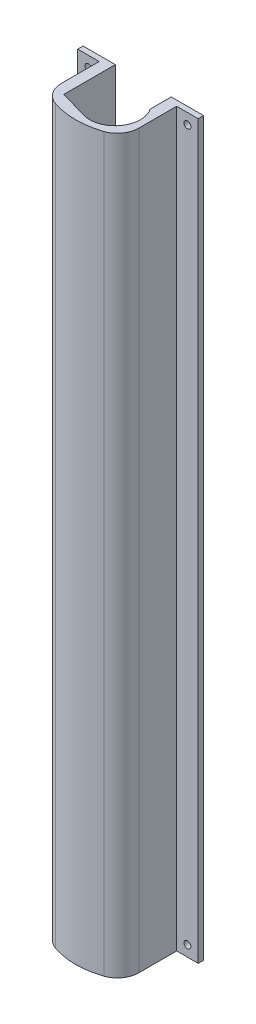
ISO-10303-21;
HEADER;
FILE_DESCRIPTION(('STEP AP214'),'2;1');
FILE_NAME('part.step','',(''),(''),'','','');
FILE_SCHEMA(('AUTOMOTIVE_DESIGN { 1 0 10303 214 1 1 1 1 }'));
ENDSEC;
DATA;
#1=APPLICATION_CONTEXT('core data for automotive mechanical design processes');
#2=APPLICATION_PROTOCOL_DEFINITION('international standard','automotive_design',2000,#1);
#3=PRODUCT_CONTEXT('',#1,'mechanical');
#4=PRODUCT('Part','Part','',(#3));
#5=PRODUCT_RELATED_PRODUCT_CATEGORY('part','',(#4));
#6=PRODUCT_DEFINITION_FORMATION('','',#4);
#7=PRODUCT_DEFINITION_CONTEXT('part definition',#1,'design');
#8=PRODUCT_DEFINITION('design','',#6,#7);
#9=PRODUCT_DEFINITION_SHAPE('','',#8);
#10=(LENGTH_UNIT() NAMED_UNIT(*) SI_UNIT(.MILLI.,.METRE.));
#11=(NAMED_UNIT(*) PLANE_ANGLE_UNIT() SI_UNIT($,.RADIAN.));
#12=(NAMED_UNIT(*) SI_UNIT($,.STERADIAN.) SOLID_ANGLE_UNIT());
#13=UNCERTAINTY_MEASURE_WITH_UNIT(LENGTH_MEASURE(1.E-05),#10,'distance_accuracy_value','');
#14=(GEOMETRIC_REPRESENTATION_CONTEXT(3) GLOBAL_UNCERTAINTY_ASSIGNED_CONTEXT((#13)) GLOBAL_UNIT_ASSIGNED_CONTEXT((#10,
#11,#12)) REPRESENTATION_CONTEXT('',''));
#15=CARTESIAN_POINT('',(0.,0.,0.));
#16=DIRECTION('',(0.,0.,1.));
#17=DIRECTION('',(1.,0.,0.));
#18=AXIS2_PLACEMENT_3D('',#15,#16,#17);
#19=CARTESIAN_POINT('',(-20.574,431.8,-9.65199999999999));
#20=DIRECTION('',(-1.,0.,0.));
#21=DIRECTION('',(0.,0.,1.));
#22=AXIS2_PLACEMENT_3D('',#19,#20,#21);
#23=PLANE('',#22);
#24=DIRECTION('',(0.,0.,-1.));
#25=VECTOR('',#24,1.);
#26=CARTESIAN_POINT('',(-20.574,0.,-9.65199999999999));
#27=LINE('',#26,#25);
#28=CARTESIAN_POINT('',(-20.574,0.,9.65212960437079));
#29=VERTEX_POINT('',#28);
#30=CARTESIAN_POINT('',(-20.574,0.,-20.7467128871305));
#31=VERTEX_POINT('',#30);
#32=EDGE_CURVE('E166',#29,#31,#27,.T.);
#33=ORIENTED_EDGE('',*,*,#32,.T.);
#34=DIRECTION('',(0.,-1.,0.));
#35=VECTOR('',#34,1.);
#36=CARTESIAN_POINT('',(-20.574,431.8,-20.7467128871305));
#37=LINE('',#36,#35);
#38=CARTESIAN_POINT('',(-20.574,431.8,-20.7467128871305));
#39=VERTEX_POINT('',#38);
#40=EDGE_CURVE('E165',#39,#31,#37,.T.);
#41=ORIENTED_EDGE('',*,*,#40,.F.);
#42=DIRECTION('',(0.,0.,-1.));
#43=VECTOR('',#42,1.);
#44=CARTESIAN_POINT('',(-20.574,431.8,-9.65199999999999));
#45=LINE('',#44,#43);
#46=CARTESIAN_POINT('',(-20.574,431.8,9.65212960437079));
#47=VERTEX_POINT('',#46);
#48=EDGE_CURVE('E150',#47,#39,#45,.T.);
#49=ORIENTED_EDGE('',*,*,#48,.F.);
#50=DIRECTION('',(0.,-1.,0.));
#51=VECTOR('',#50,1.);
#52=CARTESIAN_POINT('',(-20.574,431.8,9.65212960437079));
#53=LINE('',#52,#51);
#54=EDGE_CURVE('E212',#47,#29,#53,.T.);
#55=ORIENTED_EDGE('',*,*,#54,.T.);
#56=EDGE_LOOP('',(#33,#41,#49,#55));
#57=FACE_BOUND('',#56,.T.);
#58=ADVANCED_FACE('F41',(#57),#23,.F.);
#59=CARTESIAN_POINT('',(-39.624,431.8,-20.7467128871305));
#60=DIRECTION('',(0.,0.,1.));
#61=DIRECTION('',(1.,0.,0.));
#62=AXIS2_PLACEMENT_3D('',#59,#60,#61);
#63=PLANE('',#62);
#64=CARTESIAN_POINT('',(-33.274,6.35,-20.7467128871305));
#65=DIRECTION('',(0.,0.,1.));
#66=DIRECTION('',(1.,0.,0.));
#67=AXIS2_PLACEMENT_3D('',#64,#65,#66);
#68=CIRCLE('',#67,2.032);
#69=CARTESIAN_POINT('',(-31.242,6.35,-20.7467128871305));
#70=VERTEX_POINT('',#69);
#71=EDGE_CURVE('E542',#70,#70,#68,.T.);
#72=ORIENTED_EDGE('',*,*,#71,.T.);
#73=EDGE_LOOP('',(#72));
#74=FACE_BOUND('',#73,.T.);
#75=CARTESIAN_POINT('',(-33.274,425.45,-20.7467128871305));
#76=DIRECTION('',(0.,0.,1.));
#77=DIRECTION('',(1.,0.,0.));
#78=AXIS2_PLACEMENT_3D('',#75,#76,#77);
#79=CIRCLE('',#78,2.03200000000001);
#80=CARTESIAN_POINT('',(-31.242,425.45,-20.7467128871305));
#81=VERTEX_POINT('',#80);
#82=EDGE_CURVE('E216',#81,#81,#79,.T.);
#83=ORIENTED_EDGE('',*,*,#82,.T.);
#84=EDGE_LOOP('',(#83));
#85=FACE_BOUND('',#84,.T.);
#86=DIRECTION('',(-1.,0.,0.));
#87=VECTOR('',#86,1.);
#88=CARTESIAN_POINT('',(-39.624,0.,-20.7467128871305));
#89=LINE('',#88,#87);
#90=CARTESIAN_POINT('',(-39.624,0.,-20.7467128871305));
#91=VERTEX_POINT('',#90);
#92=EDGE_CURVE('E215',#31,#91,#89,.T.);
#93=ORIENTED_EDGE('',*,*,#92,.T.);
#94=DIRECTION('',(0.,-1.,0.));
#95=VECTOR('',#94,1.);
#96=CARTESIAN_POINT('',(-39.624,431.8,-20.7467128871305));
#97=LINE('',#96,#95);
#98=CARTESIAN_POINT('',(-39.624,431.8,-20.7467128871305));
#99=VERTEX_POINT('',#98);
#100=EDGE_CURVE('E171',#99,#91,#97,.T.);
#101=ORIENTED_EDGE('',*,*,#100,.F.);
#102=DIRECTION('',(-1.,0.,0.));
#103=VECTOR('',#102,1.);
#104=CARTESIAN_POINT('',(-39.624,431.8,-20.7467128871305));
#105=LINE('',#104,#103);
#106=EDGE_CURVE('E154',#39,#99,#105,.T.);
#107=ORIENTED_EDGE('',*,*,#106,.F.);
#108=ORIENTED_EDGE('',*,*,#40,.T.);
#109=EDGE_LOOP('',(#93,#101,#107,#108));
#110=FACE_BOUND('',#109,.T.);
#111=ADVANCED_FACE('F173',(#74,#85,#110),#63,.F.);
#112=CARTESIAN_POINT('',(-39.624,431.8,-20.7467128871305));
#113=DIRECTION('',(1.,0.,0.));
#114=DIRECTION('',(0.,0.,-1.));
#115=AXIS2_PLACEMENT_3D('',#112,#113,#114);
#116=PLANE('',#115);
#117=DIRECTION('',(0.,0.,1.));
#118=VECTOR('',#117,1.);
#119=CARTESIAN_POINT('',(-39.624,0.,-20.7467128871305));
#120=LINE('',#119,#118);
#121=CARTESIAN_POINT('',(-39.624,0.,-17.5717128871305));
#122=VERTEX_POINT('',#121);
#123=EDGE_CURVE('E219',#91,#122,#120,.T.);
#124=ORIENTED_EDGE('',*,*,#123,.T.);
#125=DIRECTION('',(0.,-1.,0.));
#126=VECTOR('',#125,1.);
#127=CARTESIAN_POINT('',(-39.624,431.8,-17.5717128871305));
#128=LINE('',#127,#126);
#129=CARTESIAN_POINT('',(-39.624,431.8,-17.5717128871305));
#130=VERTEX_POINT('',#129);
#131=EDGE_CURVE('E282',#130,#122,#128,.T.);
#132=ORIENTED_EDGE('',*,*,#131,.F.);
#133=DIRECTION('',(0.,0.,1.));
#134=VECTOR('',#133,1.);
#135=CARTESIAN_POINT('',(-39.624,431.8,-20.7467128871305));
#136=LINE('',#135,#134);
#137=EDGE_CURVE('E177',#99,#130,#136,.T.);
#138=ORIENTED_EDGE('',*,*,#137,.F.);
#139=ORIENTED_EDGE('',*,*,#100,.T.);
#140=EDGE_LOOP('',(#124,#132,#138,#139));
#141=FACE_BOUND('',#140,.T.);
#142=ADVANCED_FACE('F334',(#141),#116,.F.);
#143=CARTESIAN_POINT('',(-39.624,431.8,-17.5717128871305));
#144=DIRECTION('',(0.,0.,-1.));
#145=DIRECTION('',(-1.,0.,0.));
#146=AXIS2_PLACEMENT_3D('',#143,#144,#145);
#147=PLANE('',#146);
#148=CARTESIAN_POINT('',(-33.274,6.35,-17.5717128871305));
#149=DIRECTION('',(0.,0.,1.));
#150=DIRECTION('',(1.,0.,0.));
#151=AXIS2_PLACEMENT_3D('',#148,#149,#150);
#152=CIRCLE('',#151,2.032);
#153=CARTESIAN_POINT('',(-31.242,6.35,-17.5717128871305));
#154=VERTEX_POINT('',#153);
#155=EDGE_CURVE('E547',#154,#154,#152,.T.);
#156=ORIENTED_EDGE('',*,*,#155,.F.);
#157=EDGE_LOOP('',(#156));
#158=FACE_BOUND('',#157,.T.);
#159=CARTESIAN_POINT('',(-33.274,425.45,-17.5717128871305));
#160=DIRECTION('',(0.,0.,1.));
#161=DIRECTION('',(1.,0.,0.));
#162=AXIS2_PLACEMENT_3D('',#159,#160,#161);
#163=CIRCLE('',#162,2.03200000000001);
#164=CARTESIAN_POINT('',(-31.242,425.45,-17.5717128871305));
#165=VERTEX_POINT('',#164);
#166=EDGE_CURVE('E546',#165,#165,#163,.T.);
#167=ORIENTED_EDGE('',*,*,#166,.F.);
#168=EDGE_LOOP('',(#167));
#169=FACE_BOUND('',#168,.T.);
#170=DIRECTION('',(1.,0.,0.));
#171=VECTOR('',#170,1.);
#172=CARTESIAN_POINT('',(-39.624,0.,-17.5717128871305));
#173=LINE('',#172,#171);
#174=CARTESIAN_POINT('',(-26.924,0.,-17.5717128871305));
#175=VERTEX_POINT('',#174);
#176=EDGE_CURVE('E222',#122,#175,#173,.T.);
#177=ORIENTED_EDGE('',*,*,#176,.T.);
#178=DIRECTION('',(0.,-1.,0.));
#179=VECTOR('',#178,1.);
#180=CARTESIAN_POINT('',(-26.924,431.8,-17.5717128871305));
#181=LINE('',#180,#179);
#182=CARTESIAN_POINT('',(-26.924,431.8,-17.5717128871305));
#183=VERTEX_POINT('',#182);
#184=EDGE_CURVE('E278',#183,#175,#181,.T.);
#185=ORIENTED_EDGE('',*,*,#184,.F.);
#186=DIRECTION('',(1.,0.,0.));
#187=VECTOR('',#186,1.);
#188=CARTESIAN_POINT('',(-39.624,431.8,-17.5717128871305));
#189=LINE('',#188,#187);
#190=EDGE_CURVE('E180',#130,#183,#189,.T.);
#191=ORIENTED_EDGE('',*,*,#190,.F.);
#192=ORIENTED_EDGE('',*,*,#131,.T.);
#193=EDGE_LOOP('',(#177,#185,#191,#192));
#194=FACE_BOUND('',#193,.T.);
#195=ADVANCED_FACE('F330',(#158,#169,#194),#147,.F.);
#196=CARTESIAN_POINT('',(-26.924,431.8,-17.5717128871305));
#197=DIRECTION('',(1.,0.,0.));
#198=DIRECTION('',(0.,0.,-1.));
#199=AXIS2_PLACEMENT_3D('',#196,#197,#198);
#200=PLANE('',#199);
#201=DIRECTION('',(0.,0.,1.));
#202=VECTOR('',#201,1.);
#203=CARTESIAN_POINT('',(-26.924,0.,-17.5717128871305));
#204=LINE('',#203,#202);
#205=CARTESIAN_POINT('',(-26.924,0.,4.78647579118017));
#206=VERTEX_POINT('',#205);
#207=EDGE_CURVE('E225',#175,#206,#204,.T.);
#208=ORIENTED_EDGE('',*,*,#207,.T.);
#209=DIRECTION('',(0.,-1.,0.));
#210=VECTOR('',#209,1.);
#211=CARTESIAN_POINT('',(-26.924,431.8,4.78647579118017));
#212=LINE('',#211,#210);
#213=CARTESIAN_POINT('',(-26.924,431.8,4.78647579118017));
#214=VERTEX_POINT('',#213);
#215=EDGE_CURVE('E11',#206,#214,#212,.F.);
#216=ORIENTED_EDGE('',*,*,#215,.T.);
#217=DIRECTION('',(0.,0.,1.));
#218=VECTOR('',#217,1.);
#219=CARTESIAN_POINT('',(-26.924,431.8,-17.5717128871305));
#220=LINE('',#219,#218);
#221=EDGE_CURVE('E186',#183,#214,#220,.T.);
#222=ORIENTED_EDGE('',*,*,#221,.F.);
#223=ORIENTED_EDGE('',*,*,#184,.T.);
#224=EDGE_LOOP('',(#208,#216,#222,#223));
#225=FACE_BOUND('',#224,.T.);
#226=ADVANCED_FACE('F326',(#225),#200,.F.);
#227=CARTESIAN_POINT('',(-4.06400000000001,431.8,-25.2940311859304));
#228=DIRECTION('',(0.,-1.,0.));
#229=DIRECTION('',(0.,0.,-1.));
#230=AXIS2_PLACEMENT_3D('',#227,#228,#229);
#231=CYLINDRICAL_SURFACE('',#230,44.45);
#232=CARTESIAN_POINT('',(-4.06400000000001,0.,-25.2940311859304));
#233=DIRECTION('',(0.,1.,0.));
#234=DIRECTION('',(0.,0.,1.));
#235=AXIS2_PLACEMENT_3D('',#232,#233,#234);
#236=CIRCLE('',#235,44.45);
#237=CARTESIAN_POINT('',(-18.288,0.,16.8186785820244));
#238=VERTEX_POINT('',#237);
#239=CARTESIAN_POINT('',(10.16,0.,16.8186785820244));
#240=VERTEX_POINT('',#239);
#241=EDGE_CURVE('E228',#238,#240,#236,.T.);
#242=ORIENTED_EDGE('',*,*,#241,.T.);
#243=DIRECTION('',(0.,-1.,0.));
#244=VECTOR('',#243,1.);
#245=CARTESIAN_POINT('',(10.16,431.8,16.8186785820244));
#246=LINE('',#245,#244);
#247=CARTESIAN_POINT('',(10.16,431.8,16.8186785820244));
#248=VERTEX_POINT('',#247);
#249=EDGE_CURVE('E63',#240,#248,#246,.F.);
#250=ORIENTED_EDGE('',*,*,#249,.T.);
#251=CARTESIAN_POINT('',(-4.06400000000001,431.8,-25.2940311859304));
#252=DIRECTION('',(0.,1.,0.));
#253=DIRECTION('',(0.,0.,1.));
#254=AXIS2_PLACEMENT_3D('',#251,#252,#253);
#255=CIRCLE('',#254,44.45);
#256=CARTESIAN_POINT('',(-18.288,431.8,16.8186785820244));
#257=VERTEX_POINT('',#256);
#258=EDGE_CURVE('E189',#257,#248,#255,.T.);
#259=ORIENTED_EDGE('',*,*,#258,.F.);
#260=DIRECTION('',(0.,-1.,0.));
#261=VECTOR('',#260,1.);
#262=CARTESIAN_POINT('',(-18.288,431.8,16.8186785820244));
#263=LINE('',#262,#261);
#264=EDGE_CURVE('E297',#257,#238,#263,.T.);
#265=ORIENTED_EDGE('',*,*,#264,.T.);
#266=EDGE_LOOP('',(#242,#250,#259,#265));
#267=FACE_BOUND('',#266,.T.);
#268=ADVANCED_FACE('F320',(#267),#231,.T.);
#269=CARTESIAN_POINT('',(18.796,431.8,-17.5717128871305));
#270=DIRECTION('',(-1.,0.,0.));
#271=DIRECTION('',(0.,0.,1.));
#272=AXIS2_PLACEMENT_3D('',#269,#270,#271);
#273=PLANE('',#272);
#274=DIRECTION('',(0.,0.,-1.));
#275=VECTOR('',#274,1.);
#276=CARTESIAN_POINT('',(18.796,431.8,-17.5717128871305));
#277=LINE('',#276,#275);
#278=CARTESIAN_POINT('',(18.796,431.8,4.78647579118017));
#279=VERTEX_POINT('',#278);
#280=CARTESIAN_POINT('',(18.796,431.8,-17.5717128871305));
#281=VERTEX_POINT('',#280);
#282=EDGE_CURVE('E192',#279,#281,#277,.T.);
#283=ORIENTED_EDGE('',*,*,#282,.F.);
#284=DIRECTION('',(0.,-1.,0.));
#285=VECTOR('',#284,1.);
#286=CARTESIAN_POINT('',(18.796,431.8,4.78647579118017));
#287=LINE('',#286,#285);
#288=CARTESIAN_POINT('',(18.796,0.,4.78647579118017));
#289=VERTEX_POINT('',#288);
#290=EDGE_CURVE('E170',#279,#289,#287,.T.);
#291=ORIENTED_EDGE('',*,*,#290,.T.);
#292=DIRECTION('',(0.,0.,-1.));
#293=VECTOR('',#292,1.);
#294=CARTESIAN_POINT('',(18.796,0.,-17.5717128871305));
#295=LINE('',#294,#293);
#296=CARTESIAN_POINT('',(18.796,0.,-17.5717128871305));
#297=VERTEX_POINT('',#296);
#298=EDGE_CURVE('E231',#289,#297,#295,.T.);
#299=ORIENTED_EDGE('',*,*,#298,.T.);
#300=DIRECTION('',(0.,-1.,0.));
#301=VECTOR('',#300,1.);
#302=CARTESIAN_POINT('',(18.796,431.8,-17.5717128871305));
#303=LINE('',#302,#301);
#304=EDGE_CURVE('E274',#281,#297,#303,.T.);
#305=ORIENTED_EDGE('',*,*,#304,.F.);
#306=EDGE_LOOP('',(#283,#291,#299,#305));
#307=FACE_BOUND('',#306,.T.);
#308=ADVANCED_FACE('F312',(#307),#273,.F.);
#309=CARTESIAN_POINT('',(31.496,431.8,-17.5717128871305));
#310=DIRECTION('',(0.,0.,-1.));
#311=DIRECTION('',(-1.,0.,0.));
#312=AXIS2_PLACEMENT_3D('',#309,#310,#311);
#313=PLANE('',#312);
#314=CARTESIAN_POINT('',(25.146,425.45,-17.5717128871305));
#315=DIRECTION('',(0.,0.,1.));
#316=DIRECTION('',(1.,0.,0.));
#317=AXIS2_PLACEMENT_3D('',#314,#315,#316);
#318=CIRCLE('',#317,2.03200000000002);
#319=CARTESIAN_POINT('',(27.178,425.45,-17.5717128871305));
#320=VERTEX_POINT('',#319);
#321=EDGE_CURVE('E539',#320,#320,#318,.T.);
#322=ORIENTED_EDGE('',*,*,#321,.F.);
#323=EDGE_LOOP('',(#322));
#324=FACE_BOUND('',#323,.T.);
#325=CARTESIAN_POINT('',(25.146,6.35000000000002,-17.5717128871305));
#326=DIRECTION('',(0.,0.,1.));
#327=DIRECTION('',(1.,0.,0.));
#328=AXIS2_PLACEMENT_3D('',#325,#326,#327);
#329=CIRCLE('',#328,2.032);
#330=CARTESIAN_POINT('',(27.178,6.35000000000002,-17.5717128871305));
#331=VERTEX_POINT('',#330);
#332=EDGE_CURVE('E534',#331,#331,#329,.T.);
#333=ORIENTED_EDGE('',*,*,#332,.F.);
#334=EDGE_LOOP('',(#333));
#335=FACE_BOUND('',#334,.T.);
#336=DIRECTION('',(1.,0.,0.));
#337=VECTOR('',#336,1.);
#338=CARTESIAN_POINT('',(31.496,0.,-17.5717128871305));
#339=LINE('',#338,#337);
#340=CARTESIAN_POINT('',(31.496,0.,-17.5717128871305));
#341=VERTEX_POINT('',#340);
#342=EDGE_CURVE('E234',#297,#341,#339,.T.);
#343=ORIENTED_EDGE('',*,*,#342,.T.);
#344=DIRECTION('',(0.,-1.,0.));
#345=VECTOR('',#344,1.);
#346=CARTESIAN_POINT('',(31.496,431.8,-17.5717128871305));
#347=LINE('',#346,#345);
#348=CARTESIAN_POINT('',(31.496,431.8,-17.5717128871305));
#349=VERTEX_POINT('',#348);
#350=EDGE_CURVE('E270',#349,#341,#347,.T.);
#351=ORIENTED_EDGE('',*,*,#350,.F.);
#352=DIRECTION('',(1.,0.,0.));
#353=VECTOR('',#352,1.);
#354=CARTESIAN_POINT('',(31.496,431.8,-17.5717128871305));
#355=LINE('',#354,#353);
#356=EDGE_CURVE('E195',#281,#349,#355,.T.);
#357=ORIENTED_EDGE('',*,*,#356,.F.);
#358=ORIENTED_EDGE('',*,*,#304,.T.);
#359=EDGE_LOOP('',(#343,#351,#357,#358));
#360=FACE_BOUND('',#359,.T.);
#361=ADVANCED_FACE('F395',(#324,#335,#360),#313,.F.);
#362=CARTESIAN_POINT('',(31.496,431.8,-20.7467128871305));
#363=DIRECTION('',(-1.,0.,0.));
#364=DIRECTION('',(0.,0.,1.));
#365=AXIS2_PLACEMENT_3D('',#362,#363,#364);
#366=PLANE('',#365);
#367=DIRECTION('',(0.,0.,-1.));
#368=VECTOR('',#367,1.);
#369=CARTESIAN_POINT('',(31.496,0.,-20.7467128871305));
#370=LINE('',#369,#368);
#371=CARTESIAN_POINT('',(31.496,0.,-20.7467128871305));
#372=VERTEX_POINT('',#371);
#373=EDGE_CURVE('E237',#341,#372,#370,.T.);
#374=ORIENTED_EDGE('',*,*,#373,.T.);
#375=DIRECTION('',(0.,-1.,0.));
#376=VECTOR('',#375,1.);
#377=CARTESIAN_POINT('',(31.496,431.8,-20.7467128871305));
#378=LINE('',#377,#376);
#379=CARTESIAN_POINT('',(31.496,431.8,-20.7467128871305));
#380=VERTEX_POINT('',#379);
#381=EDGE_CURVE('E266',#380,#372,#378,.T.);
#382=ORIENTED_EDGE('',*,*,#381,.F.);
#383=DIRECTION('',(0.,0.,-1.));
#384=VECTOR('',#383,1.);
#385=CARTESIAN_POINT('',(31.496,431.8,-20.7467128871305));
#386=LINE('',#385,#384);
#387=EDGE_CURVE('E198',#349,#380,#386,.T.);
#388=ORIENTED_EDGE('',*,*,#387,.F.);
#389=ORIENTED_EDGE('',*,*,#350,.T.);
#390=EDGE_LOOP('',(#374,#382,#388,#389));
#391=FACE_BOUND('',#390,.T.);
#392=ADVANCED_FACE('F391',(#391),#366,.F.);
#393=CARTESIAN_POINT('',(12.446,431.8,-20.7467128871305));
#394=DIRECTION('',(0.,0.,1.));
#395=DIRECTION('',(1.,0.,0.));
#396=AXIS2_PLACEMENT_3D('',#393,#394,#395);
#397=PLANE('',#396);
#398=CARTESIAN_POINT('',(25.146,425.45,-20.7467128871305));
#399=DIRECTION('',(0.,0.,1.));
#400=DIRECTION('',(1.,0.,0.));
#401=AXIS2_PLACEMENT_3D('',#398,#399,#400);
#402=CIRCLE('',#401,2.03200000000002);
#403=CARTESIAN_POINT('',(27.178,425.45,-20.7467128871305));
#404=VERTEX_POINT('',#403);
#405=EDGE_CURVE('E551',#404,#404,#402,.T.);
#406=ORIENTED_EDGE('',*,*,#405,.T.);
#407=EDGE_LOOP('',(#406));
#408=FACE_BOUND('',#407,.T.);
#409=CARTESIAN_POINT('',(25.146,6.35000000000002,-20.7467128871305));
#410=DIRECTION('',(0.,0.,1.));
#411=DIRECTION('',(1.,0.,0.));
#412=AXIS2_PLACEMENT_3D('',#409,#410,#411);
#413=CIRCLE('',#412,2.032);
#414=CARTESIAN_POINT('',(27.178,6.35000000000002,-20.7467128871305));
#415=VERTEX_POINT('',#414);
#416=EDGE_CURVE('E531',#415,#415,#413,.T.);
#417=ORIENTED_EDGE('',*,*,#416,.T.);
#418=EDGE_LOOP('',(#417));
#419=FACE_BOUND('',#418,.T.);
#420=DIRECTION('',(-1.,0.,0.));
#421=VECTOR('',#420,1.);
#422=CARTESIAN_POINT('',(12.446,0.,-20.7467128871305));
#423=LINE('',#422,#421);
#424=CARTESIAN_POINT('',(12.446,0.,-20.7467128871305));
#425=VERTEX_POINT('',#424);
#426=EDGE_CURVE('E240',#372,#425,#423,.T.);
#427=ORIENTED_EDGE('',*,*,#426,.T.);
#428=DIRECTION('',(0.,-1.,0.));
#429=VECTOR('',#428,1.);
#430=CARTESIAN_POINT('',(12.446,431.8,-20.7467128871305));
#431=LINE('',#430,#429);
#432=CARTESIAN_POINT('',(12.446,431.8,-20.7467128871305));
#433=VERTEX_POINT('',#432);
#434=EDGE_CURVE('E262',#433,#425,#431,.T.);
#435=ORIENTED_EDGE('',*,*,#434,.F.);
#436=DIRECTION('',(-1.,0.,0.));
#437=VECTOR('',#436,1.);
#438=CARTESIAN_POINT('',(12.446,431.8,-20.7467128871305));
#439=LINE('',#438,#437);
#440=EDGE_CURVE('E201',#380,#433,#439,.T.);
#441=ORIENTED_EDGE('',*,*,#440,.F.);
#442=ORIENTED_EDGE('',*,*,#381,.T.);
#443=EDGE_LOOP('',(#427,#435,#441,#442));
#444=FACE_BOUND('',#443,.T.);
#445=ADVANCED_FACE('F387',(#408,#419,#444),#397,.F.);
#446=CARTESIAN_POINT('',(12.446,431.8,-20.7467128871305));
#447=DIRECTION('',(1.,0.,0.));
#448=DIRECTION('',(0.,0.,-1.));
#449=AXIS2_PLACEMENT_3D('',#446,#447,#448);
#450=PLANE('',#449);
#451=DIRECTION('',(0.,0.,1.));
#452=VECTOR('',#451,1.);
#453=CARTESIAN_POINT('',(12.446,0.,-20.7467128871305));
#454=LINE('',#453,#452);
#455=CARTESIAN_POINT('',(12.446,0.,-8.34779649654001));
#456=VERTEX_POINT('',#455);
#457=EDGE_CURVE('E243',#425,#456,#454,.T.);
#458=ORIENTED_EDGE('',*,*,#457,.T.);
#459=DIRECTION('',(0.,-1.,0.));
#460=VECTOR('',#459,1.);
#461=CARTESIAN_POINT('',(12.446,431.8,-8.34779649654001));
#462=LINE('',#461,#460);
#463=CARTESIAN_POINT('',(12.446,431.8,-8.34779649654001));
#464=VERTEX_POINT('',#463);
#465=EDGE_CURVE('E258',#464,#456,#462,.T.);
#466=ORIENTED_EDGE('',*,*,#465,.F.);
#467=DIRECTION('',(0.,0.,1.));
#468=VECTOR('',#467,1.);
#469=CARTESIAN_POINT('',(12.446,431.8,-20.7467128871305));
#470=LINE('',#469,#468);
#471=EDGE_CURVE('E204',#433,#464,#470,.T.);
#472=ORIENTED_EDGE('',*,*,#471,.F.);
#473=ORIENTED_EDGE('',*,*,#434,.T.);
#474=EDGE_LOOP('',(#458,#466,#472,#473));
#475=FACE_BOUND('',#474,.T.);
#476=ADVANCED_FACE('F383',(#475),#450,.F.);
#477=CARTESIAN_POINT('',(0.,431.8,0.));
#478=DIRECTION('',(0.,-1.,0.));
#479=DIRECTION('',(0.,0.,-1.));
#480=AXIS2_PLACEMENT_3D('',#477,#478,#479);
#481=CYLINDRICAL_SURFACE('',#480,14.9862811380157);
#482=CARTESIAN_POINT('',(0.,0.,0.));
#483=DIRECTION('',(0.,-1.,0.));
#484=DIRECTION('',(0.,0.,1.));
#485=AXIS2_PLACEMENT_3D('',#482,#483,#484);
#486=CIRCLE('',#485,14.9862811380157);
#487=CARTESIAN_POINT('',(-4.16201958345776,0.,14.3967432197202));
#488=VERTEX_POINT('',#487);
#489=EDGE_CURVE('E246',#456,#488,#486,.T.);
#490=ORIENTED_EDGE('',*,*,#489,.T.);
#491=DIRECTION('',(0.,-1.,0.));
#492=VECTOR('',#491,1.);
#493=CARTESIAN_POINT('',(-4.16201958345776,431.8,14.3967432197202));
#494=LINE('',#493,#492);
#495=CARTESIAN_POINT('',(-4.16201958345776,431.8,14.3967432197202));
#496=VERTEX_POINT('',#495);
#497=EDGE_CURVE('E254',#496,#488,#494,.T.);
#498=ORIENTED_EDGE('',*,*,#497,.F.);
#499=CARTESIAN_POINT('',(0.,431.8,0.));
#500=DIRECTION('',(0.,-1.,0.));
#501=DIRECTION('',(0.,0.,1.));
#502=AXIS2_PLACEMENT_3D('',#499,#500,#501);
#503=CIRCLE('',#502,14.9862811380157);
#504=EDGE_CURVE('E207',#464,#496,#503,.T.);
#505=ORIENTED_EDGE('',*,*,#504,.F.);
#506=ORIENTED_EDGE('',*,*,#465,.T.);
#507=EDGE_LOOP('',(#490,#498,#505,#506));
#508=FACE_BOUND('',#507,.T.);
#509=ADVANCED_FACE('F379',(#508),#481,.F.);
#510=CARTESIAN_POINT('',(-20.574,431.8,9.65212960437079));
#511=DIRECTION('',(-0.27772197419278,0.,0.960661493477523));
#512=DIRECTION('',(0.960661493477523,0.,0.27772197419278));
#513=AXIS2_PLACEMENT_3D('',#510,#511,#512);
#514=PLANE('',#513);
#515=DIRECTION('',(-0.960661493477523,0.,-0.27772197419278));
#516=VECTOR('',#515,1.);
#517=CARTESIAN_POINT('',(-20.574,0.,9.65212960437079));
#518=LINE('',#517,#516);
#519=EDGE_CURVE('E162',#488,#29,#518,.T.);
#520=ORIENTED_EDGE('',*,*,#519,.T.);
#521=ORIENTED_EDGE('',*,*,#54,.F.);
#522=DIRECTION('',(-0.960661493477523,0.,-0.27772197419278));
#523=VECTOR('',#522,1.);
#524=CARTESIAN_POINT('',(-20.574,431.8,9.65212960437079));
#525=LINE('',#524,#523);
#526=EDGE_CURVE('E157',#496,#47,#525,.T.);
#527=ORIENTED_EDGE('',*,*,#526,.F.);
#528=ORIENTED_EDGE('',*,*,#497,.T.);
#529=EDGE_LOOP('',(#520,#521,#527,#528));
#530=FACE_BOUND('',#529,.T.);
#531=ADVANCED_FACE('F374',(#530),#514,.F.);
#532=CARTESIAN_POINT('',(0.,431.8,0.));
#533=DIRECTION('',(0.,1.,0.));
#534=DIRECTION('',(0.,0.,1.));
#535=AXIS2_PLACEMENT_3D('',#532,#533,#534);
#536=PLANE('',#535);
#537=ORIENTED_EDGE('',*,*,#258,.T.);
#538=CARTESIAN_POINT('',(6.09599999999999,431.8,4.78647579118017));
#539=DIRECTION('',(0.,1.,0.));
#540=DIRECTION('',(0.,0.,1.));
#541=AXIS2_PLACEMENT_3D('',#538,#539,#540);
#542=CIRCLE('',#541,12.7);
#543=EDGE_CURVE('E50',#248,#279,#542,.T.);
#544=ORIENTED_EDGE('',*,*,#543,.T.);
#545=ORIENTED_EDGE('',*,*,#282,.T.);
#546=ORIENTED_EDGE('',*,*,#356,.T.);
#547=ORIENTED_EDGE('',*,*,#387,.T.);
#548=ORIENTED_EDGE('',*,*,#440,.T.);
#549=ORIENTED_EDGE('',*,*,#471,.T.);
#550=ORIENTED_EDGE('',*,*,#504,.T.);
#551=ORIENTED_EDGE('',*,*,#526,.T.);
#552=ORIENTED_EDGE('',*,*,#48,.T.);
#553=ORIENTED_EDGE('',*,*,#106,.T.);
#554=ORIENTED_EDGE('',*,*,#137,.T.);
#555=ORIENTED_EDGE('',*,*,#190,.T.);
#556=ORIENTED_EDGE('',*,*,#221,.T.);
#557=CARTESIAN_POINT('',(-14.224,431.8,4.78647579118017));
#558=DIRECTION('',(0.,1.,0.));
#559=DIRECTION('',(0.,0.,1.));
#560=AXIS2_PLACEMENT_3D('',#557,#558,#559);
#561=CIRCLE('',#560,12.7);
#562=EDGE_CURVE('E303',#214,#257,#561,.T.);
#563=ORIENTED_EDGE('',*,*,#562,.T.);
#564=EDGE_LOOP('',(#537,#544,#545,#546,#547,#548,#549,#550,#551,#552,#553,#554,#555,#556,#563));
#565=FACE_BOUND('',#564,.T.);
#566=ADVANCED_FACE('F152',(#565),#536,.T.);
#567=CARTESIAN_POINT('',(0.,0.,0.));
#568=DIRECTION('',(0.,1.,0.));
#569=DIRECTION('',(0.,0.,1.));
#570=AXIS2_PLACEMENT_3D('',#567,#568,#569);
#571=PLANE('',#570);
#572=ORIENTED_EDGE('',*,*,#298,.F.);
#573=CARTESIAN_POINT('',(6.09599999999999,0.,4.78647579118017));
#574=DIRECTION('',(0.,1.,0.));
#575=DIRECTION('',(0.,0.,1.));
#576=AXIS2_PLACEMENT_3D('',#573,#574,#575);
#577=CIRCLE('',#576,12.7);
#578=EDGE_CURVE('E294',#289,#240,#577,.F.);
#579=ORIENTED_EDGE('',*,*,#578,.T.);
#580=ORIENTED_EDGE('',*,*,#241,.F.);
#581=CARTESIAN_POINT('',(-14.224,0.,4.78647579118017));
#582=DIRECTION('',(0.,1.,0.));
#583=DIRECTION('',(0.,0.,1.));
#584=AXIS2_PLACEMENT_3D('',#581,#582,#583);
#585=CIRCLE('',#584,12.7);
#586=EDGE_CURVE('E291',#238,#206,#585,.F.);
#587=ORIENTED_EDGE('',*,*,#586,.T.);
#588=ORIENTED_EDGE('',*,*,#207,.F.);
#589=ORIENTED_EDGE('',*,*,#176,.F.);
#590=ORIENTED_EDGE('',*,*,#123,.F.);
#591=ORIENTED_EDGE('',*,*,#92,.F.);
#592=ORIENTED_EDGE('',*,*,#32,.F.);
#593=ORIENTED_EDGE('',*,*,#519,.F.);
#594=ORIENTED_EDGE('',*,*,#489,.F.);
#595=ORIENTED_EDGE('',*,*,#457,.F.);
#596=ORIENTED_EDGE('',*,*,#426,.F.);
#597=ORIENTED_EDGE('',*,*,#373,.F.);
#598=ORIENTED_EDGE('',*,*,#342,.F.);
#599=EDGE_LOOP('',(#572,#579,#580,#587,#588,#589,#590,#591,#592,#593,#594,#595,#596,#597,#598));
#600=FACE_BOUND('',#599,.T.);
#601=ADVANCED_FACE('F318',(#600),#571,.F.);
#602=CARTESIAN_POINT('',(25.146,6.35000000000002,-20.7467128871305));
#603=DIRECTION('',(0.,0.,1.));
#604=DIRECTION('',(1.,0.,0.));
#605=AXIS2_PLACEMENT_3D('',#602,#603,#604);
#606=CYLINDRICAL_SURFACE('',#605,2.032);
#607=ORIENTED_EDGE('',*,*,#416,.F.);
#608=EDGE_LOOP('',(#607));
#609=FACE_BOUND('',#608,.T.);
#610=ORIENTED_EDGE('',*,*,#332,.T.);
#611=EDGE_LOOP('',(#610));
#612=FACE_BOUND('',#611,.T.);
#613=ADVANCED_FACE('F368',(#609,#612),#606,.F.);
#614=CARTESIAN_POINT('',(25.146,425.45,-20.7467128871305));
#615=DIRECTION('',(0.,0.,1.));
#616=DIRECTION('',(1.,0.,0.));
#617=AXIS2_PLACEMENT_3D('',#614,#615,#616);
#618=CYLINDRICAL_SURFACE('',#617,2.03200000000002);
#619=ORIENTED_EDGE('',*,*,#405,.F.);
#620=EDGE_LOOP('',(#619));
#621=FACE_BOUND('',#620,.T.);
#622=ORIENTED_EDGE('',*,*,#321,.T.);
#623=EDGE_LOOP('',(#622));
#624=FACE_BOUND('',#623,.T.);
#625=ADVANCED_FACE('F361',(#621,#624),#618,.F.);
#626=CARTESIAN_POINT('',(-33.274,425.45,-20.7467128871305));
#627=DIRECTION('',(0.,0.,1.));
#628=DIRECTION('',(1.,0.,0.));
#629=AXIS2_PLACEMENT_3D('',#626,#627,#628);
#630=CYLINDRICAL_SURFACE('',#629,2.03200000000001);
#631=ORIENTED_EDGE('',*,*,#82,.F.);
#632=EDGE_LOOP('',(#631));
#633=FACE_BOUND('',#632,.T.);
#634=ORIENTED_EDGE('',*,*,#166,.T.);
#635=EDGE_LOOP('',(#634));
#636=FACE_BOUND('',#635,.T.);
#637=ADVANCED_FACE('F355',(#633,#636),#630,.F.);
#638=CARTESIAN_POINT('',(-33.274,6.35,-20.7467128871305));
#639=DIRECTION('',(0.,0.,1.));
#640=DIRECTION('',(1.,0.,0.));
#641=AXIS2_PLACEMENT_3D('',#638,#639,#640);
#642=CYLINDRICAL_SURFACE('',#641,2.032);
#643=ORIENTED_EDGE('',*,*,#71,.F.);
#644=EDGE_LOOP('',(#643));
#645=FACE_BOUND('',#644,.T.);
#646=ORIENTED_EDGE('',*,*,#155,.T.);
#647=EDGE_LOOP('',(#646));
#648=FACE_BOUND('',#647,.T.);
#649=ADVANCED_FACE('F350',(#645,#648),#642,.F.);
#650=CARTESIAN_POINT('',(6.09599999999999,431.8,4.78647579118017));
#651=DIRECTION('',(0.,-1.,0.));
#652=DIRECTION('',(0.,0.,-1.));
#653=AXIS2_PLACEMENT_3D('',#650,#651,#652);
#654=CYLINDRICAL_SURFACE('',#653,12.7);
#655=ORIENTED_EDGE('',*,*,#543,.F.);
#656=ORIENTED_EDGE('',*,*,#249,.F.);
#657=ORIENTED_EDGE('',*,*,#578,.F.);
#658=ORIENTED_EDGE('',*,*,#290,.F.);
#659=EDGE_LOOP('',(#655,#656,#657,#658));
#660=FACE_BOUND('',#659,.T.);
#661=ADVANCED_FACE('F315',(#660),#654,.T.);
#662=CARTESIAN_POINT('',(-14.224,431.8,4.78647579118017));
#663=DIRECTION('',(0.,-1.,0.));
#664=DIRECTION('',(0.,0.,-1.));
#665=AXIS2_PLACEMENT_3D('',#662,#663,#664);
#666=CYLINDRICAL_SURFACE('',#665,12.7);
#667=ORIENTED_EDGE('',*,*,#562,.F.);
#668=ORIENTED_EDGE('',*,*,#215,.F.);
#669=ORIENTED_EDGE('',*,*,#586,.F.);
#670=ORIENTED_EDGE('',*,*,#264,.F.);
#671=EDGE_LOOP('',(#667,#668,#669,#670));
#672=FACE_BOUND('',#671,.T.);
#673=ADVANCED_FACE('F43',(#672),#666,.T.);
#674=CLOSED_SHELL('',(#58,#111,#142,#195,#226,#268,#308,#361,#392,#445,#476,#509,#531,#566,#601,
#613,#625,#637,#649,#661,#673));
#675=MANIFOLD_SOLID_BREP('B2',#674);
#676=ADVANCED_BREP_SHAPE_REPRESENTATION('',(#18,#675),#14);
#677=SHAPE_DEFINITION_REPRESENTATION(#9,#676);
ENDSEC;
END-ISO-10303-21;
